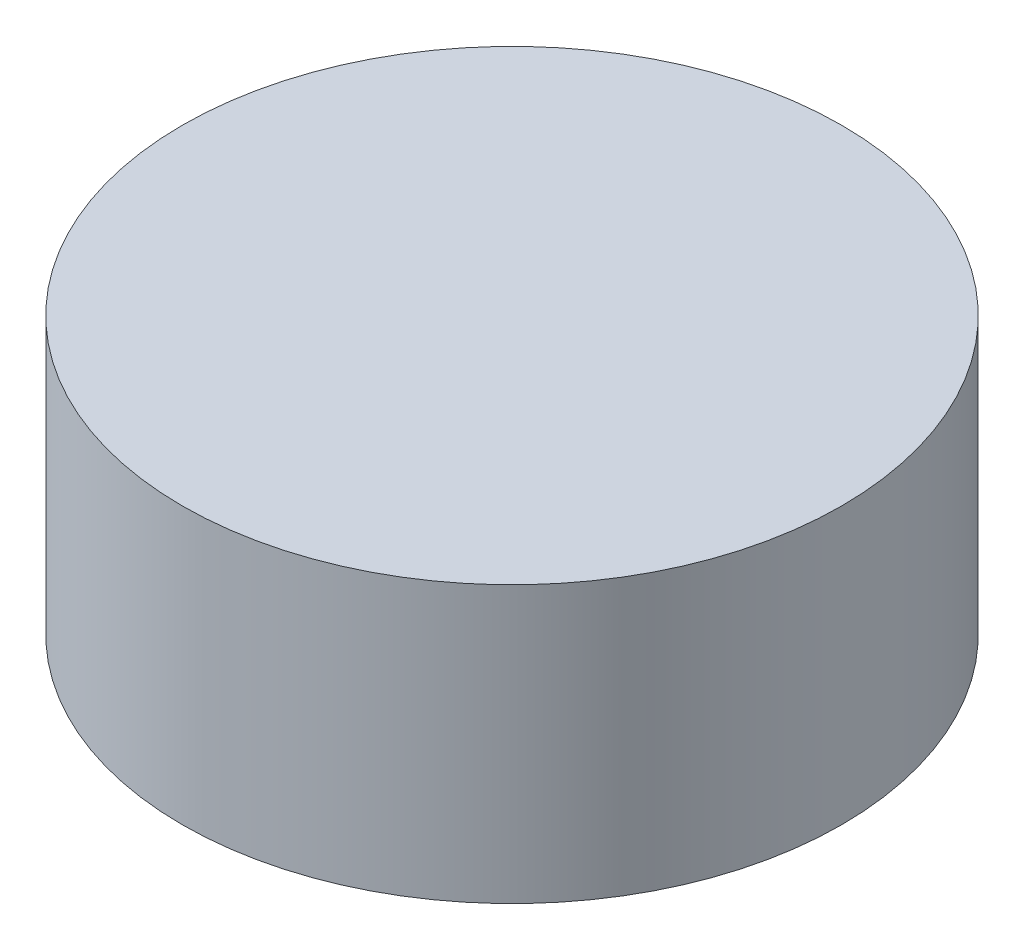
ISO-10303-21;
HEADER;
FILE_DESCRIPTION(('STEP AP214'),'2;1');
FILE_NAME('part.step','',(''),(''),'','','');
FILE_SCHEMA(('AUTOMOTIVE_DESIGN { 1 0 10303 214 1 1 1 1 }'));
ENDSEC;
DATA;
#1=APPLICATION_CONTEXT('core data for automotive mechanical design processes');
#2=APPLICATION_PROTOCOL_DEFINITION('international standard','automotive_design',2000,#1);
#3=PRODUCT_CONTEXT('',#1,'mechanical');
#4=PRODUCT('Part','Part','',(#3));
#5=PRODUCT_RELATED_PRODUCT_CATEGORY('part','',(#4));
#6=PRODUCT_DEFINITION_FORMATION('','',#4);
#7=PRODUCT_DEFINITION_CONTEXT('part definition',#1,'design');
#8=PRODUCT_DEFINITION('design','',#6,#7);
#9=PRODUCT_DEFINITION_SHAPE('','',#8);
#10=(LENGTH_UNIT() NAMED_UNIT(*) SI_UNIT(.MILLI.,.METRE.));
#11=(NAMED_UNIT(*) PLANE_ANGLE_UNIT() SI_UNIT($,.RADIAN.));
#12=(NAMED_UNIT(*) SI_UNIT($,.STERADIAN.) SOLID_ANGLE_UNIT());
#13=UNCERTAINTY_MEASURE_WITH_UNIT(LENGTH_MEASURE(1.E-05),#10,'distance_accuracy_value','');
#14=(GEOMETRIC_REPRESENTATION_CONTEXT(3) GLOBAL_UNCERTAINTY_ASSIGNED_CONTEXT((#13)) GLOBAL_UNIT_ASSIGNED_CONTEXT((#10,
#11,#12)) REPRESENTATION_CONTEXT('',''));
#15=CARTESIAN_POINT('',(0.,0.,0.));
#16=DIRECTION('',(0.,0.,1.));
#17=DIRECTION('',(1.,0.,0.));
#18=AXIS2_PLACEMENT_3D('',#15,#16,#17);
#19=CARTESIAN_POINT('',(0.,17.018,0.));
#20=DIRECTION('',(0.,-1.,0.));
#21=DIRECTION('',(0.,0.,-1.));
#22=AXIS2_PLACEMENT_3D('',#19,#20,#21);
#23=CYLINDRICAL_SURFACE('',#22,20.32);
#24=CARTESIAN_POINT('',(0.,17.018,0.));
#25=DIRECTION('',(0.,1.,0.));
#26=DIRECTION('',(0.,0.,1.));
#27=AXIS2_PLACEMENT_3D('',#24,#25,#26);
#28=CIRCLE('',#27,20.32);
#29=CARTESIAN_POINT('',(0.,17.018,20.32));
#30=VERTEX_POINT('',#29);
#31=EDGE_CURVE('E10',#30,#30,#28,.T.);
#32=ORIENTED_EDGE('',*,*,#31,.F.);
#33=EDGE_LOOP('',(#32));
#34=FACE_BOUND('',#33,.T.);
#35=CARTESIAN_POINT('',(0.,0.,0.));
#36=DIRECTION('',(0.,1.,0.));
#37=DIRECTION('',(0.,0.,1.));
#38=AXIS2_PLACEMENT_3D('',#35,#36,#37);
#39=CIRCLE('',#38,20.32);
#40=CARTESIAN_POINT('',(0.,0.,20.32));
#41=VERTEX_POINT('',#40);
#42=EDGE_CURVE('E40',#41,#41,#39,.T.);
#43=ORIENTED_EDGE('',*,*,#42,.T.);
#44=EDGE_LOOP('',(#43));
#45=FACE_BOUND('',#44,.T.);
#46=ADVANCED_FACE('F37',(#34,#45),#23,.T.);
#47=CARTESIAN_POINT('',(0.,17.018,0.));
#48=DIRECTION('',(0.,1.,0.));
#49=DIRECTION('',(0.,0.,1.));
#50=AXIS2_PLACEMENT_3D('',#47,#48,#49);
#51=PLANE('',#50);
#52=ORIENTED_EDGE('',*,*,#31,.T.);
#53=EDGE_LOOP('',(#52));
#54=FACE_BOUND('',#53,.T.);
#55=ADVANCED_FACE('F54',(#54),#51,.T.);
#56=CARTESIAN_POINT('',(0.,0.,0.));
#57=DIRECTION('',(0.,1.,0.));
#58=DIRECTION('',(0.,0.,1.));
#59=AXIS2_PLACEMENT_3D('',#56,#57,#58);
#60=PLANE('',#59);
#61=ORIENTED_EDGE('',*,*,#42,.F.);
#62=EDGE_LOOP('',(#61));
#63=FACE_BOUND('',#62,.T.);
#64=ADVANCED_FACE('F52',(#63),#60,.F.);
#65=CLOSED_SHELL('',(#46,#55,#64));
#66=MANIFOLD_SOLID_BREP('B2',#65);
#67=ADVANCED_BREP_SHAPE_REPRESENTATION('',(#18,#66),#14);
#68=SHAPE_DEFINITION_REPRESENTATION(#9,#67);
ENDSEC;
END-ISO-10303-21;
